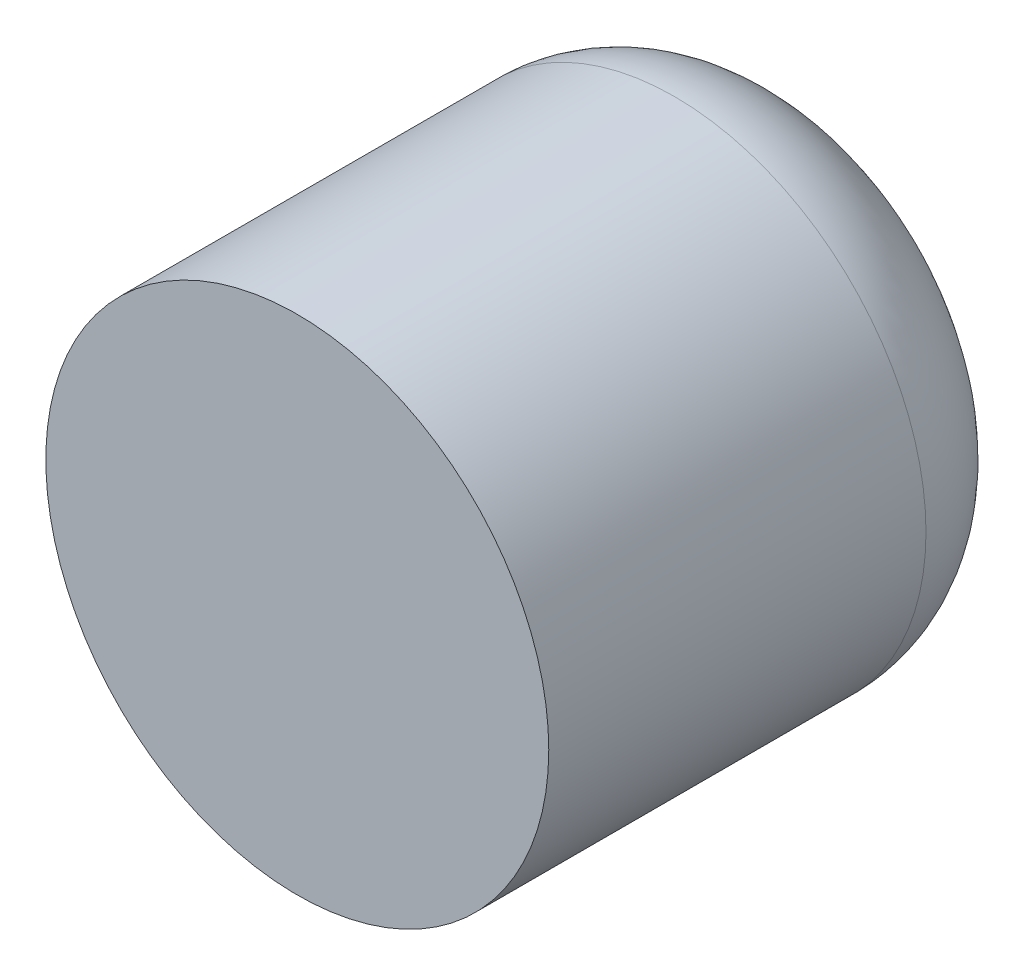
ISO-10303-21;
HEADER;
FILE_DESCRIPTION(('STEP AP214'),'2;1');
FILE_NAME('part.step','',(''),(''),'','','');
FILE_SCHEMA(('AUTOMOTIVE_DESIGN { 1 0 10303 214 1 1 1 1 }'));
ENDSEC;
DATA;
#1=APPLICATION_CONTEXT('core data for automotive mechanical design processes');
#2=APPLICATION_PROTOCOL_DEFINITION('international standard','automotive_design',2000,#1);
#3=PRODUCT_CONTEXT('',#1,'mechanical');
#4=PRODUCT('Part','Part','',(#3));
#5=PRODUCT_RELATED_PRODUCT_CATEGORY('part','',(#4));
#6=PRODUCT_DEFINITION_FORMATION('','',#4);
#7=PRODUCT_DEFINITION_CONTEXT('part definition',#1,'design');
#8=PRODUCT_DEFINITION('design','',#6,#7);
#9=PRODUCT_DEFINITION_SHAPE('','',#8);
#10=(LENGTH_UNIT() NAMED_UNIT(*) SI_UNIT(.MILLI.,.METRE.));
#11=(NAMED_UNIT(*) PLANE_ANGLE_UNIT() SI_UNIT($,.RADIAN.));
#12=(NAMED_UNIT(*) SI_UNIT($,.STERADIAN.) SOLID_ANGLE_UNIT());
#13=UNCERTAINTY_MEASURE_WITH_UNIT(LENGTH_MEASURE(1.E-05),#10,'distance_accuracy_value','');
#14=(GEOMETRIC_REPRESENTATION_CONTEXT(3) GLOBAL_UNCERTAINTY_ASSIGNED_CONTEXT((#13)) GLOBAL_UNIT_ASSIGNED_CONTEXT((#10,
#11,#12)) REPRESENTATION_CONTEXT('',''));
#15=CARTESIAN_POINT('',(0.,0.,0.));
#16=DIRECTION('',(0.,0.,1.));
#17=DIRECTION('',(1.,0.,0.));
#18=AXIS2_PLACEMENT_3D('',#15,#16,#17);
#19=CARTESIAN_POINT('',(-1.15,-0.25,-0.7));
#20=DIRECTION('',(0.,0.,1.));
#21=DIRECTION('',(1.,0.,0.));
#22=AXIS2_PLACEMENT_3D('',#19,#20,#21);
#23=PLANE('',#22);
#24=CARTESIAN_POINT('',(-1.15,-0.25,-0.7));
#25=DIRECTION('',(0.,0.,-1.));
#26=DIRECTION('',(-1.,0.,0.));
#27=AXIS2_PLACEMENT_3D('',#24,#25,#26);
#28=CIRCLE('',#27,0.2);
#29=CARTESIAN_POINT('',(-1.35,-0.25,-0.7));
#30=VERTEX_POINT('',#29);
#31=EDGE_CURVE('E19',#30,#30,#28,.F.);
#32=ORIENTED_EDGE('',*,*,#31,.F.);
#33=EDGE_LOOP('',(#32));
#34=FACE_BOUND('',#33,.T.);
#35=ADVANCED_FACE('F15',(#34),#23,.F.);
#36=CARTESIAN_POINT('',(-1.15,-0.25,-0.5));
#37=DIRECTION('',(0.,0.,-1.));
#38=DIRECTION('',(-1.,0.,0.));
#39=AXIS2_PLACEMENT_3D('',#36,#37,#38);
#40=DEGENERATE_TOROIDAL_SURFACE('',#39,0.2,0.2,.T.);
#41=CARTESIAN_POINT('',(-1.15,-0.25,-0.5));
#42=DIRECTION('',(0.,0.,1.));
#43=DIRECTION('',(1.,0.,0.));
#44=AXIS2_PLACEMENT_3D('',#41,#42,#43);
#45=CIRCLE('',#44,0.4);
#46=CARTESIAN_POINT('',(-0.75,-0.25,-0.5));
#47=VERTEX_POINT('',#46);
#48=EDGE_CURVE('E23',#47,#47,#45,.T.);
#49=ORIENTED_EDGE('',*,*,#48,.F.);
#50=EDGE_LOOP('',(#49));
#51=FACE_BOUND('',#50,.T.);
#52=ORIENTED_EDGE('',*,*,#31,.T.);
#53=EDGE_LOOP('',(#52));
#54=FACE_BOUND('',#53,.T.);
#55=ADVANCED_FACE('F17',(#51,#54),#40,.T.);
#56=CARTESIAN_POINT('',(-1.15,-0.25,0.1));
#57=DIRECTION('',(0.,0.,1.));
#58=DIRECTION('',(1.,0.,0.));
#59=AXIS2_PLACEMENT_3D('',#56,#57,#58);
#60=PLANE('',#59);
#61=CARTESIAN_POINT('',(-1.15,-0.25,0.1));
#62=DIRECTION('',(0.,0.,1.));
#63=DIRECTION('',(1.,0.,0.));
#64=AXIS2_PLACEMENT_3D('',#61,#62,#63);
#65=CIRCLE('',#64,0.4);
#66=CARTESIAN_POINT('',(-0.75,-0.25,0.1));
#67=VERTEX_POINT('',#66);
#68=EDGE_CURVE('E10',#67,#67,#65,.F.);
#69=ORIENTED_EDGE('',*,*,#68,.F.);
#70=EDGE_LOOP('',(#69));
#71=FACE_BOUND('',#70,.T.);
#72=ADVANCED_FACE('F39',(#71),#60,.T.);
#73=CARTESIAN_POINT('',(-1.15,-0.25,-0.7));
#74=DIRECTION('',(0.,0.,1.));
#75=DIRECTION('',(1.,0.,0.));
#76=AXIS2_PLACEMENT_3D('',#73,#74,#75);
#77=CYLINDRICAL_SURFACE('',#76,0.4);
#78=ORIENTED_EDGE('',*,*,#68,.T.);
#79=EDGE_LOOP('',(#78));
#80=FACE_BOUND('',#79,.T.);
#81=ORIENTED_EDGE('',*,*,#48,.T.);
#82=EDGE_LOOP('',(#81));
#83=FACE_BOUND('',#82,.T.);
#84=ADVANCED_FACE('F42',(#80,#83),#77,.T.);
#85=CLOSED_SHELL('',(#35,#55,#72,#84));
#86=MANIFOLD_SOLID_BREP('B1',#85);
#87=ADVANCED_BREP_SHAPE_REPRESENTATION('',(#18,#86),#14);
#88=SHAPE_DEFINITION_REPRESENTATION(#9,#87);
ENDSEC;
END-ISO-10303-21;
